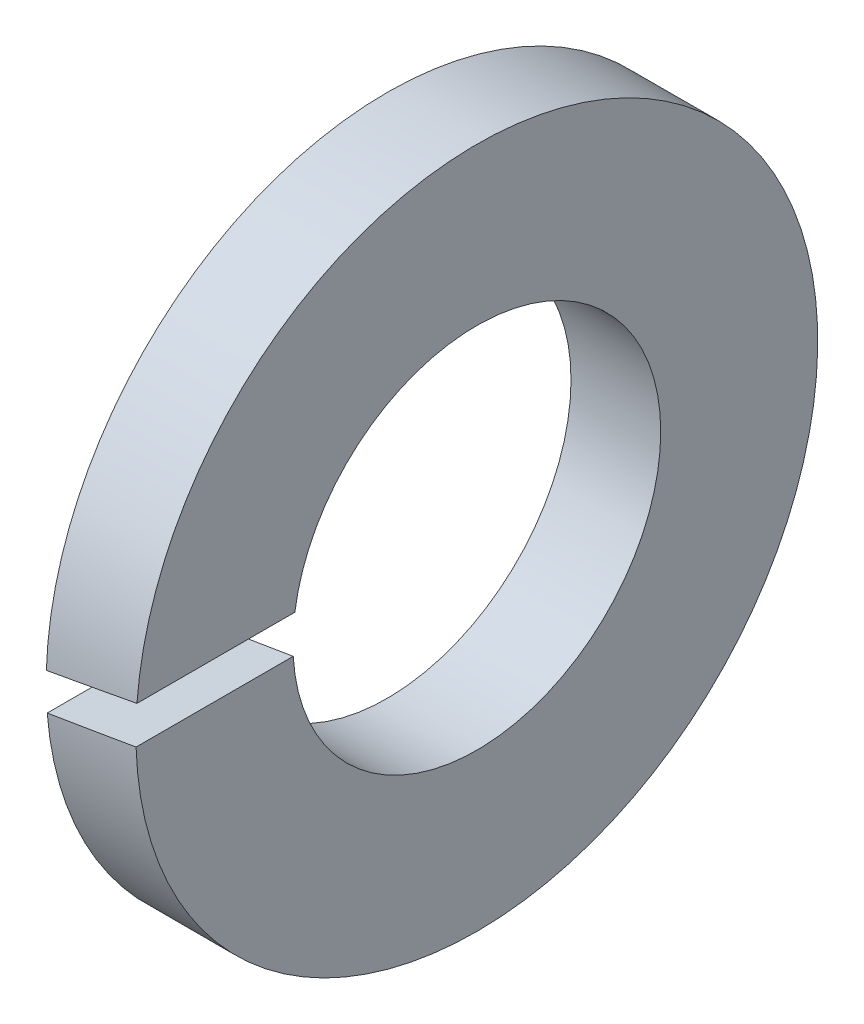
ISO-10303-21;
HEADER;
FILE_DESCRIPTION(('STEP AP214'),'2;1');
FILE_NAME('part.step','',(''),(''),'','','');
FILE_SCHEMA(('AUTOMOTIVE_DESIGN { 1 0 10303 214 1 1 1 1 }'));
ENDSEC;
DATA;
#1=APPLICATION_CONTEXT('core data for automotive mechanical design processes');
#2=APPLICATION_PROTOCOL_DEFINITION('international standard','automotive_design',2000,#1);
#3=PRODUCT_CONTEXT('',#1,'mechanical');
#4=PRODUCT('Part','Part','',(#3));
#5=PRODUCT_RELATED_PRODUCT_CATEGORY('part','',(#4));
#6=PRODUCT_DEFINITION_FORMATION('','',#4);
#7=PRODUCT_DEFINITION_CONTEXT('part definition',#1,'design');
#8=PRODUCT_DEFINITION('design','',#6,#7);
#9=PRODUCT_DEFINITION_SHAPE('','',#8);
#10=(LENGTH_UNIT() NAMED_UNIT(*) SI_UNIT(.MILLI.,.METRE.));
#11=(NAMED_UNIT(*) PLANE_ANGLE_UNIT() SI_UNIT($,.RADIAN.));
#12=(NAMED_UNIT(*) SI_UNIT($,.STERADIAN.) SOLID_ANGLE_UNIT());
#13=UNCERTAINTY_MEASURE_WITH_UNIT(LENGTH_MEASURE(1.E-05),#10,'distance_accuracy_value','');
#14=(GEOMETRIC_REPRESENTATION_CONTEXT(3) GLOBAL_UNCERTAINTY_ASSIGNED_CONTEXT((#13)) GLOBAL_UNIT_ASSIGNED_CONTEXT((#10,
#11,#12)) REPRESENTATION_CONTEXT('',''));
#15=CARTESIAN_POINT('',(0.,0.,0.));
#16=DIRECTION('',(0.,0.,1.));
#17=DIRECTION('',(1.,0.,0.));
#18=AXIS2_PLACEMENT_3D('',#15,#16,#17);
#19=CARTESIAN_POINT('',(-1.,2.05,0.));
#20=DIRECTION('',(1.,0.,0.));
#21=DIRECTION('',(0.,0.,-1.));
#22=AXIS2_PLACEMENT_3D('',#19,#20,#21);
#23=PLANE('',#22);
#24=DIRECTION('',(0.,0.,-1.));
#25=VECTOR('',#24,1.);
#26=CARTESIAN_POINT('',(-1.,-0.296325945790808,3.8));
#27=LINE('',#26,#25);
#28=CARTESIAN_POINT('',(-1.,-0.296325945790808,3.78842855731122));
#29=VERTEX_POINT('',#28);
#30=CARTESIAN_POINT('',(-1.,-0.296325945790808,2.02847009685901));
#31=VERTEX_POINT('',#30);
#32=EDGE_CURVE('E80',#29,#31,#27,.T.);
#33=ORIENTED_EDGE('',*,*,#32,.T.);
#34=CARTESIAN_POINT('',(-1.,0.,0.));
#35=DIRECTION('',(-1.,0.,0.));
#36=DIRECTION('',(0.,0.,1.));
#37=AXIS2_PLACEMENT_3D('',#34,#35,#36);
#38=CIRCLE('',#37,2.05);
#39=CARTESIAN_POINT('',(-1.,0.119998965082347,2.04648485173459));
#40=VERTEX_POINT('',#39);
#41=EDGE_CURVE('E88',#40,#31,#38,.T.);
#42=ORIENTED_EDGE('',*,*,#41,.F.);
#43=DIRECTION('',(0.,0.,-1.));
#44=VECTOR('',#43,1.);
#45=CARTESIAN_POINT('',(-1.,0.119998965082347,3.8));
#46=LINE('',#45,#44);
#47=CARTESIAN_POINT('',(-1.,0.119998965082347,3.79810482324793));
#48=VERTEX_POINT('',#47);
#49=EDGE_CURVE('E48',#48,#40,#46,.T.);
#50=ORIENTED_EDGE('',*,*,#49,.F.);
#51=CARTESIAN_POINT('',(-1.,0.,0.));
#52=DIRECTION('',(-1.,0.,0.));
#53=DIRECTION('',(0.,0.,1.));
#54=AXIS2_PLACEMENT_3D('',#51,#52,#53);
#55=CIRCLE('',#54,3.8);
#56=EDGE_CURVE('E86',#48,#29,#55,.T.);
#57=ORIENTED_EDGE('',*,*,#56,.T.);
#58=EDGE_LOOP('',(#33,#42,#50,#57));
#59=FACE_BOUND('',#58,.T.);
#60=ADVANCED_FACE('F34',(#59),#23,.F.);
#61=CARTESIAN_POINT('',(-1.,0.,0.));
#62=DIRECTION('',(-1.,0.,0.));
#63=DIRECTION('',(0.,0.,1.));
#64=AXIS2_PLACEMENT_3D('',#61,#62,#63);
#65=CYLINDRICAL_SURFACE('',#64,3.8);
#66=CARTESIAN_POINT('',(0.680547949044465,0.,0.));
#67=DIRECTION('',(-0.173648177666927,0.984807753012209,0.));
#68=DIRECTION('',(-0.984807753012209,-0.173648177666927,0.));
#69=AXIS2_PLACEMENT_3D('',#66,#67,#68);
#70=ELLIPSE('',#69,21.8833278359462,3.8);
#71=CARTESIAN_POINT('',(0.,-0.119998965082347,3.79810482324793));
#72=VERTEX_POINT('',#71);
#73=EDGE_CURVE('E79',#29,#72,#70,.T.);
#74=ORIENTED_EDGE('',*,*,#73,.F.);
#75=ORIENTED_EDGE('',*,*,#56,.F.);
#76=CARTESIAN_POINT('',(-1.68054794904447,0.,0.));
#77=DIRECTION('',(0.173648177666927,-0.984807753012209,0.));
#78=DIRECTION('',(-0.984807753012209,-0.173648177666927,0.));
#79=AXIS2_PLACEMENT_3D('',#76,#77,#78);
#80=ELLIPSE('',#79,21.8833278359462,3.8);
#81=CARTESIAN_POINT('',(0.,0.296325945790809,3.78842855731122));
#82=VERTEX_POINT('',#81);
#83=EDGE_CURVE('E71',#82,#48,#80,.T.);
#84=ORIENTED_EDGE('',*,*,#83,.F.);
#85=CARTESIAN_POINT('',(0.,0.,0.));
#86=DIRECTION('',(-1.,0.,0.));
#87=DIRECTION('',(0.,0.,1.));
#88=AXIS2_PLACEMENT_3D('',#85,#86,#87);
#89=CIRCLE('',#88,3.8);
#90=EDGE_CURVE('E92',#82,#72,#89,.T.);
#91=ORIENTED_EDGE('',*,*,#90,.T.);
#92=EDGE_LOOP('',(#74,#75,#84,#91));
#93=FACE_BOUND('',#92,.T.);
#94=ADVANCED_FACE('F91',(#93),#65,.T.);
#95=CARTESIAN_POINT('',(0.,2.05,0.));
#96=DIRECTION('',(-1.,0.,0.));
#97=DIRECTION('',(0.,0.,1.));
#98=AXIS2_PLACEMENT_3D('',#95,#96,#97);
#99=PLANE('',#98);
#100=DIRECTION('',(0.,0.,-1.));
#101=VECTOR('',#100,1.);
#102=CARTESIAN_POINT('',(0.,-0.119998965082347,3.8));
#103=LINE('',#102,#101);
#104=CARTESIAN_POINT('',(0.,-0.119998965082347,2.04648485173459));
#105=VERTEX_POINT('',#104);
#106=EDGE_CURVE('E55',#72,#105,#103,.T.);
#107=ORIENTED_EDGE('',*,*,#106,.F.);
#108=ORIENTED_EDGE('',*,*,#90,.F.);
#109=DIRECTION('',(0.,0.,-1.));
#110=VECTOR('',#109,1.);
#111=CARTESIAN_POINT('',(0.,0.296325945790809,3.8));
#112=LINE('',#111,#110);
#113=CARTESIAN_POINT('',(0.,0.296325945790809,2.02847009685901));
#114=VERTEX_POINT('',#113);
#115=EDGE_CURVE('E74',#82,#114,#112,.T.);
#116=ORIENTED_EDGE('',*,*,#115,.T.);
#117=CARTESIAN_POINT('',(0.,0.,0.));
#118=DIRECTION('',(-1.,0.,0.));
#119=DIRECTION('',(0.,0.,1.));
#120=AXIS2_PLACEMENT_3D('',#117,#118,#119);
#121=CIRCLE('',#120,2.05);
#122=EDGE_CURVE('E94',#114,#105,#121,.T.);
#123=ORIENTED_EDGE('',*,*,#122,.T.);
#124=EDGE_LOOP('',(#107,#108,#116,#123));
#125=FACE_BOUND('',#124,.T.);
#126=ADVANCED_FACE('F105',(#125),#99,.F.);
#127=CARTESIAN_POINT('',(-1.,0.,0.));
#128=DIRECTION('',(-1.,0.,0.));
#129=DIRECTION('',(0.,0.,1.));
#130=AXIS2_PLACEMENT_3D('',#127,#128,#129);
#131=CYLINDRICAL_SURFACE('',#130,2.05);
#132=CARTESIAN_POINT('',(0.680547949044465,0.,0.));
#133=DIRECTION('',(-0.173648177666927,0.984807753012209,0.));
#134=DIRECTION('',(-0.984807753012209,-0.173648177666927,0.));
#135=AXIS2_PLACEMENT_3D('',#132,#133,#134);
#136=ELLIPSE('',#135,11.8054794904447,2.05);
#137=EDGE_CURVE('E11',#105,#31,#136,.F.);
#138=ORIENTED_EDGE('',*,*,#137,.F.);
#139=ORIENTED_EDGE('',*,*,#122,.F.);
#140=CARTESIAN_POINT('',(-1.68054794904447,0.,0.));
#141=DIRECTION('',(0.173648177666927,-0.984807753012209,0.));
#142=DIRECTION('',(-0.984807753012209,-0.173648177666927,0.));
#143=AXIS2_PLACEMENT_3D('',#140,#141,#142);
#144=ELLIPSE('',#143,11.8054794904447,2.05);
#145=EDGE_CURVE('E41',#40,#114,#144,.F.);
#146=ORIENTED_EDGE('',*,*,#145,.F.);
#147=ORIENTED_EDGE('',*,*,#41,.T.);
#148=EDGE_LOOP('',(#138,#139,#146,#147));
#149=FACE_BOUND('',#148,.T.);
#150=ADVANCED_FACE('F107',(#149),#131,.F.);
#151=CARTESIAN_POINT('',(-1.,0.119998965082347,3.8));
#152=DIRECTION('',(0.173648177666927,-0.984807753012209,0.));
#153=DIRECTION('',(0.984807753012209,0.173648177666927,0.));
#154=AXIS2_PLACEMENT_3D('',#151,#152,#153);
#155=PLANE('',#154);
#156=ORIENTED_EDGE('',*,*,#83,.T.);
#157=ORIENTED_EDGE('',*,*,#49,.T.);
#158=ORIENTED_EDGE('',*,*,#145,.T.);
#159=ORIENTED_EDGE('',*,*,#115,.F.);
#160=EDGE_LOOP('',(#156,#157,#158,#159));
#161=FACE_BOUND('',#160,.T.);
#162=ADVANCED_FACE('F72',(#161),#155,.T.);
#163=CARTESIAN_POINT('',(0.,-0.119998965082347,3.8));
#164=DIRECTION('',(-0.173648177666927,0.984807753012209,0.));
#165=DIRECTION('',(-0.984807753012209,-0.173648177666927,0.));
#166=AXIS2_PLACEMENT_3D('',#163,#164,#165);
#167=PLANE('',#166);
#168=ORIENTED_EDGE('',*,*,#73,.T.);
#169=ORIENTED_EDGE('',*,*,#106,.T.);
#170=ORIENTED_EDGE('',*,*,#137,.T.);
#171=ORIENTED_EDGE('',*,*,#32,.F.);
#172=EDGE_LOOP('',(#168,#169,#170,#171));
#173=FACE_BOUND('',#172,.T.);
#174=ADVANCED_FACE('F108',(#173),#167,.T.);
#175=CLOSED_SHELL('',(#60,#94,#126,#150,#162,#174));
#176=MANIFOLD_SOLID_BREP('B2',#175);
#177=ADVANCED_BREP_SHAPE_REPRESENTATION('',(#18,#176),#14);
#178=SHAPE_DEFINITION_REPRESENTATION(#9,#177);
ENDSEC;
END-ISO-10303-21;
